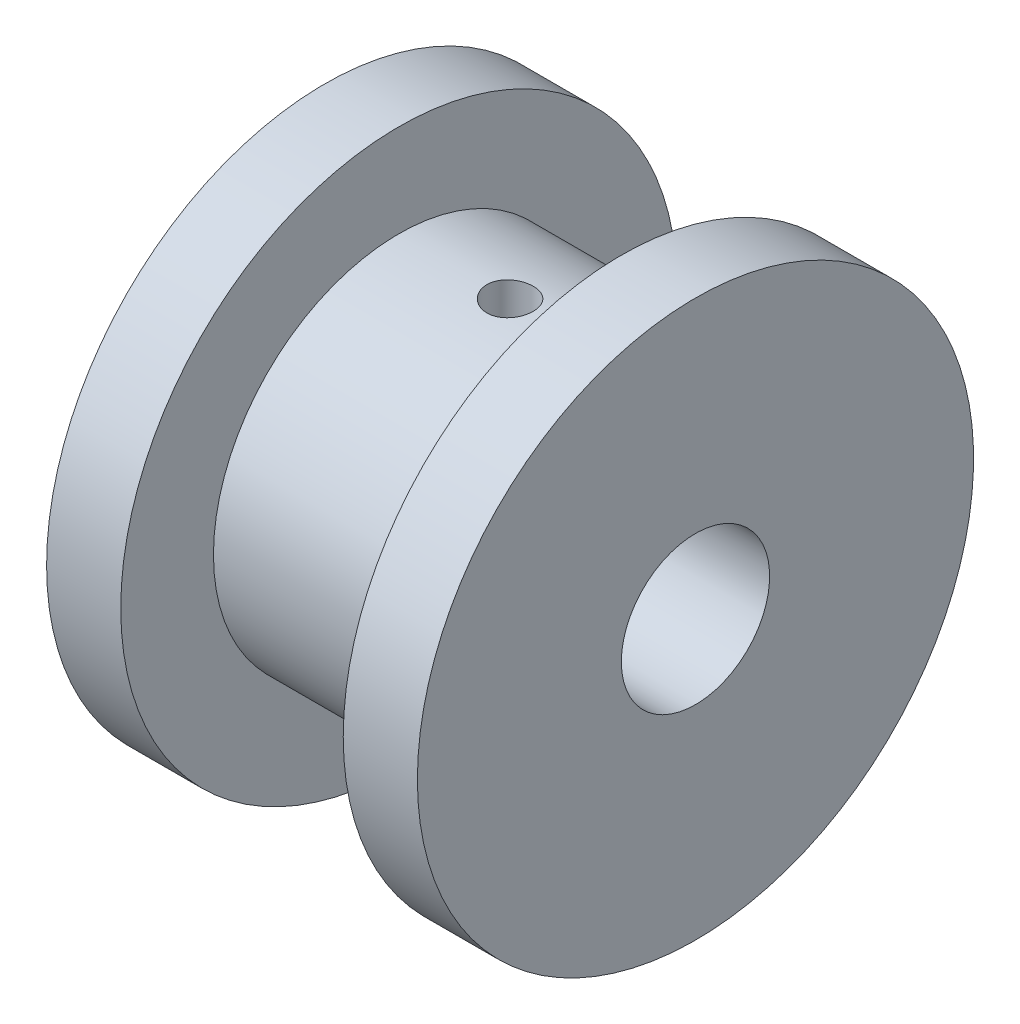
ISO-10303-21;
HEADER;
FILE_DESCRIPTION(('STEP AP214'),'2;1');
FILE_NAME('part.step','',(''),(''),'','','');
FILE_SCHEMA(('AUTOMOTIVE_DESIGN { 1 0 10303 214 1 1 1 1 }'));
ENDSEC;
DATA;
#1=APPLICATION_CONTEXT('core data for automotive mechanical design processes');
#2=APPLICATION_PROTOCOL_DEFINITION('international standard','automotive_design',2000,#1);
#3=PRODUCT_CONTEXT('',#1,'mechanical');
#4=PRODUCT('Part','Part','',(#3));
#5=PRODUCT_RELATED_PRODUCT_CATEGORY('part','',(#4));
#6=PRODUCT_DEFINITION_FORMATION('','',#4);
#7=PRODUCT_DEFINITION_CONTEXT('part definition',#1,'design');
#8=PRODUCT_DEFINITION('design','',#6,#7);
#9=PRODUCT_DEFINITION_SHAPE('','',#8);
#10=(LENGTH_UNIT() NAMED_UNIT(*) SI_UNIT(.MILLI.,.METRE.));
#11=(NAMED_UNIT(*) PLANE_ANGLE_UNIT() SI_UNIT($,.RADIAN.));
#12=(NAMED_UNIT(*) SI_UNIT($,.STERADIAN.) SOLID_ANGLE_UNIT());
#13=UNCERTAINTY_MEASURE_WITH_UNIT(LENGTH_MEASURE(1.E-05),#10,'distance_accuracy_value','');
#14=(GEOMETRIC_REPRESENTATION_CONTEXT(3) GLOBAL_UNCERTAINTY_ASSIGNED_CONTEXT((#13)) GLOBAL_UNIT_ASSIGNED_CONTEXT((#10,
#11,#12)) REPRESENTATION_CONTEXT('',''));
#15=CARTESIAN_POINT('',(0.,0.,0.));
#16=DIRECTION('',(0.,0.,1.));
#17=DIRECTION('',(1.,0.,0.));
#18=AXIS2_PLACEMENT_3D('',#15,#16,#17);
#19=CARTESIAN_POINT('',(0.,0.,-4.));
#20=DIRECTION('',(1.,0.,0.));
#21=DIRECTION('',(0.,0.,-1.));
#22=AXIS2_PLACEMENT_3D('',#19,#20,#21);
#23=PLANE('',#22);
#24=CARTESIAN_POINT('',(0.,0.,0.));
#25=DIRECTION('',(-1.,0.,0.));
#26=DIRECTION('',(0.,0.,1.));
#27=AXIS2_PLACEMENT_3D('',#24,#25,#26);
#28=CIRCLE('',#27,4.);
#29=CARTESIAN_POINT('',(0.,0.,4.));
#30=VERTEX_POINT('',#29);
#31=EDGE_CURVE('E76',#30,#30,#28,.T.);
#32=ORIENTED_EDGE('',*,*,#31,.F.);
#33=EDGE_LOOP('',(#32));
#34=FACE_BOUND('',#33,.T.);
#35=CARTESIAN_POINT('',(0.,0.,0.));
#36=DIRECTION('',(-1.,0.,0.));
#37=DIRECTION('',(0.,0.,1.));
#38=AXIS2_PLACEMENT_3D('',#35,#36,#37);
#39=CIRCLE('',#38,15.);
#40=CARTESIAN_POINT('',(0.,0.,15.));
#41=VERTEX_POINT('',#40);
#42=EDGE_CURVE('E10',#41,#41,#39,.T.);
#43=ORIENTED_EDGE('',*,*,#42,.T.);
#44=EDGE_LOOP('',(#43));
#45=FACE_BOUND('',#44,.T.);
#46=ADVANCED_FACE('F41',(#34,#45),#23,.F.);
#47=CARTESIAN_POINT('',(0.,0.,0.));
#48=DIRECTION('',(-1.,0.,0.));
#49=DIRECTION('',(0.,0.,1.));
#50=AXIS2_PLACEMENT_3D('',#47,#48,#49);
#51=CYLINDRICAL_SURFACE('',#50,15.);
#52=ORIENTED_EDGE('',*,*,#42,.F.);
#53=EDGE_LOOP('',(#52));
#54=FACE_BOUND('',#53,.T.);
#55=CARTESIAN_POINT('',(4.,0.,0.));
#56=DIRECTION('',(-1.,0.,0.));
#57=DIRECTION('',(0.,0.,1.));
#58=AXIS2_PLACEMENT_3D('',#55,#56,#57);
#59=CIRCLE('',#58,15.);
#60=CARTESIAN_POINT('',(4.,0.,15.));
#61=VERTEX_POINT('',#60);
#62=EDGE_CURVE('E48',#61,#61,#59,.T.);
#63=ORIENTED_EDGE('',*,*,#62,.T.);
#64=EDGE_LOOP('',(#63));
#65=FACE_BOUND('',#64,.T.);
#66=ADVANCED_FACE('F127',(#54,#65),#51,.T.);
#67=CARTESIAN_POINT('',(4.,0.,-15.));
#68=DIRECTION('',(-1.,0.,0.));
#69=DIRECTION('',(0.,0.,1.));
#70=AXIS2_PLACEMENT_3D('',#67,#68,#69);
#71=PLANE('',#70);
#72=ORIENTED_EDGE('',*,*,#62,.F.);
#73=EDGE_LOOP('',(#72));
#74=FACE_BOUND('',#73,.T.);
#75=CARTESIAN_POINT('',(4.,0.,0.));
#76=DIRECTION('',(-1.,0.,0.));
#77=DIRECTION('',(0.,0.,1.));
#78=AXIS2_PLACEMENT_3D('',#75,#76,#77);
#79=CIRCLE('',#78,10.);
#80=CARTESIAN_POINT('',(4.,0.,10.));
#81=VERTEX_POINT('',#80);
#82=EDGE_CURVE('E53',#81,#81,#79,.T.);
#83=ORIENTED_EDGE('',*,*,#82,.T.);
#84=EDGE_LOOP('',(#83));
#85=FACE_BOUND('',#84,.T.);
#86=ADVANCED_FACE('F122',(#74,#85),#71,.F.);
#87=CARTESIAN_POINT('',(0.,0.,0.));
#88=DIRECTION('',(-1.,0.,0.));
#89=DIRECTION('',(0.,0.,1.));
#90=AXIS2_PLACEMENT_3D('',#87,#88,#89);
#91=CYLINDRICAL_SURFACE('',#90,10.);
#92=CARTESIAN_POINT('',(10.,9.92156741649221,1.25));
#93=CARTESIAN_POINT('',(9.93008185810409,9.92156842085664,1.24999702741697));
#94=CARTESIAN_POINT('',(9.86012001754759,9.92231447559473,1.24411394951064));
#95=CARTESIAN_POINT('',(9.7221433872977,9.92521695489986,1.22073820686067));
#96=CARTESIAN_POINT('',(9.65413070975148,9.92737485321481,1.20323341054564));
#97=CARTESIAN_POINT('',(9.52207005894198,9.93285286887714,1.15713834641298));
#98=CARTESIAN_POINT('',(9.45801942894067,9.93617219726825,1.12855560239912));
#99=CARTESIAN_POINT('',(9.33563577408846,9.94359811759954,1.06113209921476));
#100=CARTESIAN_POINT('',(9.27730177412847,9.94770457492142,1.02229309368739));
#101=CARTESIAN_POINT('',(9.16766887643894,9.9562677962195,0.935226725132208));
#102=CARTESIAN_POINT('',(9.11640659884056,9.96072620851022,0.886953407512147));
#103=CARTESIAN_POINT('',(9.02268861553046,9.96947616437916,0.782487630335613));
#104=CARTESIAN_POINT('',(8.98023334795266,9.97376769964692,0.726294777029015));
#105=CARTESIAN_POINT('',(8.90520321024682,9.98171722306411,0.607354915337985));
#106=CARTESIAN_POINT('',(8.87266147745017,9.98537306923403,0.544586847780556));
#107=CARTESIAN_POINT('',(8.81859440002952,9.99162118477263,0.414423359027958));
#108=CARTESIAN_POINT('',(8.79706864653674,9.99421349361484,0.347028109680452));
#109=CARTESIAN_POINT('',(8.76575396583279,9.99803084353114,0.209897843875555));
#110=CARTESIAN_POINT('',(8.75590416073806,9.9992629741797,0.140176929831688));
#111=CARTESIAN_POINT('',(8.74803230748173,10.0002453486461,6.16003432728679E-05));
#112=CARTESIAN_POINT('',(8.75000979402373,9.99999565076039,-0.0703327884973859));
#113=CARTESIAN_POINT('',(8.76568760137872,9.99804823885005,-0.209382634487274));
#114=CARTESIAN_POINT('',(8.77932244924069,9.99635861227864,-0.278045602882226));
#115=CARTESIAN_POINT('',(8.81782558831497,9.99173027971167,-0.412101081952687));
#116=CARTESIAN_POINT('',(8.84269409308342,9.98879154997023,-0.477493530428102));
#117=CARTESIAN_POINT('',(8.90302824639189,9.98198128903956,-0.603354407719319));
#118=CARTESIAN_POINT('',(8.93852222886509,9.97810726921619,-0.663809113920258));
#119=CARTESIAN_POINT('',(9.01907918110802,9.96985984532641,-0.777928726153237));
#120=CARTESIAN_POINT('',(9.06414258973429,9.96548641836132,-0.831593320608677));
#121=CARTESIAN_POINT('',(9.16292590929919,9.95669433761757,-0.930994015386471));
#122=CARTESIAN_POINT('',(9.21670287977333,9.95227557902364,-0.976673419997996));
#123=CARTESIAN_POINT('',(9.33119077839123,9.9439203597029,-1.05836642531255));
#124=CARTESIAN_POINT('',(9.39190172826903,9.9399839004879,-1.09437999571755));
#125=CARTESIAN_POINT('',(9.51858474778116,9.93303901306359,-1.15572228679137));
#126=CARTESIAN_POINT('',(9.5845590399766,9.93003097954065,-1.18104646493116));
#127=CARTESIAN_POINT('',(9.71986972676342,9.92529121247978,-1.22024082723404));
#128=CARTESIAN_POINT('',(9.78920595915436,9.92355941743351,-1.23411156339981));
#129=CARTESIAN_POINT('',(9.92877159099988,9.92157944392025,-1.2499302159543));
#130=CARTESIAN_POINT('',(9.9989918115444,9.92132133721188,-1.25195792099914));
#131=CARTESIAN_POINT('',(10.1387709648327,9.92229170559824,-1.24424347661528));
#132=CARTESIAN_POINT('',(10.2083299116397,9.92352014900725,-1.2345015780549));
#133=CARTESIAN_POINT('',(10.3445728817889,9.92731614241993,-1.20359164289886));
#134=CARTESIAN_POINT('',(10.4112658075952,9.9298791634733,-1.18246224187303));
#135=CARTESIAN_POINT('',(10.5401620774266,9.93605184985404,-1.12941685955806));
#136=CARTESIAN_POINT('',(10.6023652636204,9.93966155195382,-1.09750049929061));
#137=CARTESIAN_POINT('',(10.7208773219065,9.94754465676617,-1.02359101107746));
#138=CARTESIAN_POINT('',(10.7771533326572,9.95182146368541,-0.981545559788552));
#139=CARTESIAN_POINT('',(10.8818782769675,9.96054619775512,-0.888645371184477));
#140=CARTESIAN_POINT('',(10.930326905934,9.96499413155644,-0.837790291212741));
#141=CARTESIAN_POINT('',(11.0183020936672,9.9735904434348,-0.72836588777926));
#142=CARTESIAN_POINT('',(11.0577762233975,9.97773696956261,-0.669754246058515));
#143=CARTESIAN_POINT('',(11.1263191088169,9.98523556515805,-0.546686290840893));
#144=CARTESIAN_POINT('',(11.1553880742405,9.98858765063858,-0.48223009518416));
#145=CARTESIAN_POINT('',(11.202208893454,9.99411145326594,-0.349476929569726));
#146=CARTESIAN_POINT('',(11.2199910480158,9.99628632843852,-0.281190783255888));
#147=CARTESIAN_POINT('',(11.2438320446134,9.99922377338782,-0.142573028638979));
#148=CARTESIAN_POINT('',(11.2498914152996,9.99998640685089,-0.0722415127190527));
#149=CARTESIAN_POINT('',(11.2501049611461,10.0000131400683,0.0679585916718923));
#150=CARTESIAN_POINT('',(11.244339980284,9.9992874158392,0.137827068857367));
#151=CARTESIAN_POINT('',(11.2212396932846,9.99643920578969,0.275593870726307));
#152=CARTESIAN_POINT('',(11.2039043951941,9.99431672094073,0.343492196779924));
#153=CARTESIAN_POINT('',(11.1581809428252,9.98891242606017,0.475380721493657));
#154=CARTESIAN_POINT('',(11.1297966603134,9.98563102217235,0.539372280079785));
#155=CARTESIAN_POINT('',(11.0627893426962,9.9782722380314,0.66169666857201));
#156=CARTESIAN_POINT('',(11.0241661858692,9.97419484831559,0.720029431194013));
#157=CARTESIAN_POINT('',(10.9374783923318,9.96566596962789,0.829793383981277));
#158=CARTESIAN_POINT('',(10.8893536032382,9.9612122063946,0.881176893917149));
#159=CARTESIAN_POINT('',(10.7851535279856,9.95245079506771,0.975170559409672));
#160=CARTESIAN_POINT('',(10.7290763612545,9.94814318183499,1.01777863389674));
#161=CARTESIAN_POINT('',(10.6103150386513,9.94014405697344,1.09315262125802));
#162=CARTESIAN_POINT('',(10.5476062050325,9.93645498876141,1.12587989158337));
#163=CARTESIAN_POINT('',(10.4175716297026,9.93013929059811,1.18029264417167));
#164=CARTESIAN_POINT('',(10.3502510003483,9.92751150576939,1.20199013561415));
#165=CARTESIAN_POINT('',(10.2354850064782,9.92425393409921,1.22853294811899));
#166=CARTESIAN_POINT('',(10.1887635242312,9.92325150760955,1.23657151550529));
#167=CARTESIAN_POINT('',(10.0947013750165,9.92190791114956,1.24730602795275));
#168=CARTESIAN_POINT('',(10.0473607127495,9.92156673616213,1.25000201354966));
#169=CARTESIAN_POINT('',(10.,9.92156741649221,1.25));
#170=B_SPLINE_CURVE_WITH_KNOTS('',3,(#92,#93,#94,#95,#96,#97,#98,#99,#100,#101,#102,#103,#104,
#105,#106,#107,#108,#109,#110,#111,#112,#113,#114,#115,#116,#117,#118,#119,#120,#121,#122,#123,
#124,#125,#126,#127,#128,#129,#130,#131,#132,#133,#134,#135,#136,#137,#138,#139,#140,#141,#142,
#143,#144,#145,#146,#147,#148,#149,#150,#151,#152,#153,#154,#155,#156,#157,#158,#159,#160,#161,
#162,#163,#164,#165,#166,#167,#168,#169),.UNSPECIFIED.,.T.,.F.,(4,2,2,2,2,2,2,2,2,2,2,2,2,2,2,2,
2,2,2,2,2,2,2,2,2,2,2,2,2,2,2,2,2,2,2,2,2,2,4),(0.,0.20958140873962,0.41938193807619,
0.6290402262906,0.838662689753061,1.04933288774533,1.26001356371289,1.4713909307287,
1.68276045169915,1.89302298470728,2.10327724585054,2.31235832466519,2.52144337835894,
2.73109102206401,2.94074828234552,3.15183848688884,3.36292935309712,3.57410983369504,
3.78528013578093,3.99502608902941,4.20476757163557,4.41380188146366,4.62284353605926,
4.83298909772054,5.04314283497404,5.2544944294617,5.46584176354438,5.67661928392469,
5.88738729886405,6.09671908144126,6.30605071843393,6.51530906772044,6.72456990482123,
6.93520064445417,7.14588127719913,7.35737548852416,7.56863892991007,7.71060494816473,
7.85256988927735),.UNSPECIFIED.);
#171=CARTESIAN_POINT('',(10.,9.92156741649221,1.25));
#172=VERTEX_POINT('',#171);
#173=EDGE_CURVE('E80',#172,#172,#170,.T.);
#174=ORIENTED_EDGE('',*,*,#173,.T.);
#175=EDGE_LOOP('',(#174));
#176=FACE_BOUND('',#175,.T.);
#177=ORIENTED_EDGE('',*,*,#82,.F.);
#178=EDGE_LOOP('',(#177));
#179=FACE_BOUND('',#178,.T.);
#180=CARTESIAN_POINT('',(16.,0.,0.));
#181=DIRECTION('',(-1.,0.,0.));
#182=DIRECTION('',(0.,0.,1.));
#183=AXIS2_PLACEMENT_3D('',#180,#181,#182);
#184=CIRCLE('',#183,10.);
#185=CARTESIAN_POINT('',(16.,0.,10.));
#186=VERTEX_POINT('',#185);
#187=EDGE_CURVE('E58',#186,#186,#184,.T.);
#188=ORIENTED_EDGE('',*,*,#187,.T.);
#189=EDGE_LOOP('',(#188));
#190=FACE_BOUND('',#189,.T.);
#191=ADVANCED_FACE('F94',(#176,#179,#190),#91,.T.);
#192=CARTESIAN_POINT('',(16.,0.,-10.));
#193=DIRECTION('',(1.,0.,0.));
#194=DIRECTION('',(0.,0.,-1.));
#195=AXIS2_PLACEMENT_3D('',#192,#193,#194);
#196=PLANE('',#195);
#197=ORIENTED_EDGE('',*,*,#187,.F.);
#198=EDGE_LOOP('',(#197));
#199=FACE_BOUND('',#198,.T.);
#200=CARTESIAN_POINT('',(16.,0.,0.));
#201=DIRECTION('',(-1.,0.,0.));
#202=DIRECTION('',(0.,0.,1.));
#203=AXIS2_PLACEMENT_3D('',#200,#201,#202);
#204=CIRCLE('',#203,15.);
#205=CARTESIAN_POINT('',(16.,0.,15.));
#206=VERTEX_POINT('',#205);
#207=EDGE_CURVE('E64',#206,#206,#204,.T.);
#208=ORIENTED_EDGE('',*,*,#207,.T.);
#209=EDGE_LOOP('',(#208));
#210=FACE_BOUND('',#209,.T.);
#211=ADVANCED_FACE('F115',(#199,#210),#196,.F.);
#212=CARTESIAN_POINT('',(0.,0.,0.));
#213=DIRECTION('',(-1.,0.,0.));
#214=DIRECTION('',(0.,0.,1.));
#215=AXIS2_PLACEMENT_3D('',#212,#213,#214);
#216=CYLINDRICAL_SURFACE('',#215,15.);
#217=ORIENTED_EDGE('',*,*,#207,.F.);
#218=EDGE_LOOP('',(#217));
#219=FACE_BOUND('',#218,.T.);
#220=CARTESIAN_POINT('',(20.,0.,0.));
#221=DIRECTION('',(-1.,0.,0.));
#222=DIRECTION('',(0.,0.,1.));
#223=AXIS2_PLACEMENT_3D('',#220,#221,#222);
#224=CIRCLE('',#223,15.);
#225=CARTESIAN_POINT('',(20.,0.,15.));
#226=VERTEX_POINT('',#225);
#227=EDGE_CURVE('E68',#226,#226,#224,.T.);
#228=ORIENTED_EDGE('',*,*,#227,.T.);
#229=EDGE_LOOP('',(#228));
#230=FACE_BOUND('',#229,.T.);
#231=ADVANCED_FACE('F112',(#219,#230),#216,.T.);
#232=CARTESIAN_POINT('',(20.,0.,-4.));
#233=DIRECTION('',(-1.,0.,0.));
#234=DIRECTION('',(0.,0.,1.));
#235=AXIS2_PLACEMENT_3D('',#232,#233,#234);
#236=PLANE('',#235);
#237=ORIENTED_EDGE('',*,*,#227,.F.);
#238=EDGE_LOOP('',(#237));
#239=FACE_BOUND('',#238,.T.);
#240=CARTESIAN_POINT('',(20.,0.,0.));
#241=DIRECTION('',(-1.,0.,0.));
#242=DIRECTION('',(0.,0.,1.));
#243=AXIS2_PLACEMENT_3D('',#240,#241,#242);
#244=CIRCLE('',#243,4.);
#245=CARTESIAN_POINT('',(20.,0.,4.));
#246=VERTEX_POINT('',#245);
#247=EDGE_CURVE('E72',#246,#246,#244,.T.);
#248=ORIENTED_EDGE('',*,*,#247,.T.);
#249=EDGE_LOOP('',(#248));
#250=FACE_BOUND('',#249,.T.);
#251=ADVANCED_FACE('F108',(#239,#250),#236,.F.);
#252=CARTESIAN_POINT('',(0.,0.,0.));
#253=DIRECTION('',(-1.,0.,0.));
#254=DIRECTION('',(0.,0.,1.));
#255=AXIS2_PLACEMENT_3D('',#252,#253,#254);
#256=CYLINDRICAL_SURFACE('',#255,4.);
#257=CARTESIAN_POINT('',(10.,3.79967103839267,1.25));
#258=CARTESIAN_POINT('',(10.0683470361093,3.79967145961936,1.24999953780047));
#259=CARTESIAN_POINT('',(10.1366987687032,3.80153531505043,1.24437538791494));
#260=CARTESIAN_POINT('',(10.2713941608778,3.80875638998877,1.22209175401327));
#261=CARTESIAN_POINT('',(10.3377372727322,3.81411455353136,1.20542928782515));
#262=CARTESIAN_POINT('',(10.466444901932,3.8276593883596,1.16169788223559));
#263=CARTESIAN_POINT('',(10.5288162331057,3.83584105194317,1.13464735736677));
#264=CARTESIAN_POINT('',(10.648152695864,3.85410406218688,1.07096914173157));
#265=CARTESIAN_POINT('',(10.7051168699601,3.86418574435841,1.03433975905632));
#266=CARTESIAN_POINT('',(10.8139788674935,3.8855012766862,0.95119607062229));
#267=CARTESIAN_POINT('',(10.865663609436,3.8967612338478,0.904409399720395));
#268=CARTESIAN_POINT('',(10.9605960132092,3.91894245860336,0.802862046455491));
#269=CARTESIAN_POINT('',(11.0038424969448,3.92986367872627,0.748100252518562));
#270=CARTESIAN_POINT('',(11.0816110630112,3.95043553390078,0.630625912493359));
#271=CARTESIAN_POINT('',(11.1159137038315,3.9600518456278,0.567761556520092));
#272=CARTESIAN_POINT('',(11.1733760498555,3.97662551833019,0.436804232853401));
#273=CARTESIAN_POINT('',(11.1965383741496,3.98358350419919,0.36871249848705));
#274=CARTESIAN_POINT('',(11.2303511280971,3.99387175820863,0.231464356966097));
#275=CARTESIAN_POINT('',(11.2413657497878,3.99730738984143,0.162405715468214));
#276=CARTESIAN_POINT('',(11.2517243464375,4.00053595876015,0.0233408139845193));
#277=CARTESIAN_POINT('',(11.2510709743588,4.00032972410065,-0.0466652269730842));
#278=CARTESIAN_POINT('',(11.2383517084141,3.99637116132537,-0.183074480354735));
#279=CARTESIAN_POINT('',(11.226680616487,3.99274150972157,-0.249518634314045));
#280=CARTESIAN_POINT('',(11.192905009957,3.98249482560855,-0.379453063347771));
#281=CARTESIAN_POINT('',(11.1707998149134,3.97587759827134,-0.442943145481196));
#282=CARTESIAN_POINT('',(11.1165298109251,3.96023459729533,-0.566078103154781));
#283=CARTESIAN_POINT('',(11.084245191437,3.95118033616957,-0.62566640562283));
#284=CARTESIAN_POINT('',(11.0106289002954,3.93161722953562,-0.738702511152028));
#285=CARTESIAN_POINT('',(10.9692949408622,3.92110801644584,-0.792148756208837));
#286=CARTESIAN_POINT('',(10.8767263651987,3.89923670734646,-0.89373769845388));
#287=CARTESIAN_POINT('',(10.8251509311588,3.88785731989084,-0.941566549094177));
#288=CARTESIAN_POINT('',(10.7146048981755,3.86590615440412,-1.02798974259538));
#289=CARTESIAN_POINT('',(10.655633429425,3.85533447159847,-1.06658299775341));
#290=CARTESIAN_POINT('',(10.5310825311402,3.83610846648974,-1.13380465019765));
#291=CARTESIAN_POINT('',(10.4654365909576,3.82747690354324,-1.16231680702682));
#292=CARTESIAN_POINT('',(10.3299405081047,3.81337545338913,-1.20778345948513));
#293=CARTESIAN_POINT('',(10.2600918857895,3.80790443033294,-1.22474210765793));
#294=CARTESIAN_POINT('',(10.1211800474342,3.80099563391872,-1.24601485185708));
#295=CARTESIAN_POINT('',(10.0521980037679,3.79940466389696,-1.25080954353711));
#296=CARTESIAN_POINT('',(9.91441025850184,3.80001077463985,-1.24896744498307));
#297=CARTESIAN_POINT('',(9.84560453129954,3.80220727008389,-1.24233242111456));
#298=CARTESIAN_POINT('',(9.71219170334836,3.80998957482874,-1.21824873513143));
#299=CARTESIAN_POINT('',(9.64752072592601,3.81547554101732,-1.20111831160537));
#300=CARTESIAN_POINT('',(9.52197820800396,3.82911287331661,-1.15690373661027));
#301=CARTESIAN_POINT('',(9.46110728907881,3.83726467412388,-1.12981796171154));
#302=CARTESIAN_POINT('',(9.34296089022825,3.85560539653156,-1.06557510655874));
#303=CARTESIAN_POINT('',(9.28583858440722,3.86584603489733,-1.02815147488557));
#304=CARTESIAN_POINT('',(9.17850965363808,3.88710348972829,-0.944606408679808));
#305=CARTESIAN_POINT('',(9.12830483107467,3.89812050735703,-0.898482714690781));
#306=CARTESIAN_POINT('',(9.03408963408719,3.92024187562679,-0.796572947753602));
#307=CARTESIAN_POINT('',(8.99042221386014,3.9313309228568,-0.740465649788518));
#308=CARTESIAN_POINT('',(8.91310895667874,3.95189059843678,-0.621451545651395));
#309=CARTESIAN_POINT('',(8.87946266068896,3.96136130090946,-0.558545051108621));
#310=CARTESIAN_POINT('',(8.82346943752832,3.97756311928512,-0.42810552333183));
#311=CARTESIAN_POINT('',(8.80104071215632,3.984313995612,-0.360610184283755));
#312=CARTESIAN_POINT('',(8.7679274614103,3.99440242648576,-0.222557254056389));
#313=CARTESIAN_POINT('',(8.75723926091651,3.99774104914277,-0.152000628340356));
#314=CARTESIAN_POINT('',(8.74820899825038,4.00055803404462,-0.0129849366488983));
#315=CARTESIAN_POINT('',(8.74937154982924,4.0001912940739,0.0554391919465225));
#316=CARTESIAN_POINT('',(8.7628118110487,3.99600978081049,0.191073221923248));
#317=CARTESIAN_POINT('',(8.77508879599195,3.99219523232619,0.258283202179568));
#318=CARTESIAN_POINT('',(8.81009400922228,3.98159570844796,0.388755118480791));
#319=CARTESIAN_POINT('',(8.83268960784537,3.97484847960205,0.45205591844948));
#320=CARTESIAN_POINT('',(8.88757082720848,3.9590794558795,0.57399842550009));
#321=CARTESIAN_POINT('',(8.91985810997343,3.95005727091358,0.632639331274481));
#322=CARTESIAN_POINT('',(8.99447275834444,3.93029896883376,0.745761694969688));
#323=CARTESIAN_POINT('',(9.03710352246397,3.91951509750962,0.800034607053111));
#324=CARTESIAN_POINT('',(9.13065988944347,3.89758736547061,0.900820791399319));
#325=CARTESIAN_POINT('',(9.18158797413939,3.88644339784826,0.947331733504159));
#326=CARTESIAN_POINT('',(9.2923157198411,3.86461892577438,1.03282865911252));
#327=CARTESIAN_POINT('',(9.35235340311658,3.85396600863456,1.07151427994711));
#328=CARTESIAN_POINT('',(9.47839812026914,3.83480125279531,1.13820470748521));
#329=CARTESIAN_POINT('',(9.54440272645025,3.82628854861387,1.16621383403546));
#330=CARTESIAN_POINT('',(9.67472261731467,3.81306560440328,1.20871180435792));
#331=CARTESIAN_POINT('',(9.73870254745156,3.80809315043749,1.22414939837873));
#332=CARTESIAN_POINT('',(9.86845383209649,3.80139606482399,1.24479245816099));
#333=CARTESIAN_POINT('',(9.9342247412015,3.79967063301598,1.25000044480778));
#334=CARTESIAN_POINT('',(10.,3.79967103839267,1.25));
#335=B_SPLINE_CURVE_WITH_KNOTS('',3,(#257,#258,#259,#260,#261,#262,#263,#264,#265,#266,#267,
#268,#269,#270,#271,#272,#273,#274,#275,#276,#277,#278,#279,#280,#281,#282,#283,#284,#285,#286,
#287,#288,#289,#290,#291,#292,#293,#294,#295,#296,#297,#298,#299,#300,#301,#302,#303,#304,#305,
#306,#307,#308,#309,#310,#311,#312,#313,#314,#315,#316,#317,#318,#319,#320,#321,#322,#323,#324,
#325,#326,#327,#328,#329,#330,#331,#332,#333,#334),.UNSPECIFIED.,.T.,.F.,(4,2,2,2,2,2,2,2,2,2,2,
2,2,2,2,2,2,2,2,2,2,2,2,2,2,2,2,2,2,2,2,2,2,2,2,2,2,2,4),(0.,0.204798137548489,
0.409651627059736,0.614143644118581,0.818671804924948,1.02957080550838,1.24049922941123,
1.45619821963733,1.67184647417922,1.88083722835533,2.08978046471774,2.2915098296975,
2.49325235190093,2.69746404608409,2.90172742713187,3.11450338937334,3.32730439853776,
3.54248470934454,3.75758763952752,3.96404933287935,4.17047912219089,4.37093972044362,
4.57143302253209,4.7776761330961,4.9839728801188,5.19881937811511,5.41365603317086,
5.62690239290997,5.84008198140584,6.04438802439524,6.24868074692306,6.45041846514758,
6.65219079911651,6.86080693105214,7.0694855777219,7.28507795501704,7.50058300803821,
7.69772354371385,7.89481549188778),.UNSPECIFIED.);
#336=CARTESIAN_POINT('',(10.,3.79967103839267,1.25));
#337=VERTEX_POINT('',#336);
#338=EDGE_CURVE('E89',#337,#337,#335,.T.);
#339=ORIENTED_EDGE('',*,*,#338,.T.);
#340=EDGE_LOOP('',(#339));
#341=FACE_BOUND('',#340,.T.);
#342=ORIENTED_EDGE('',*,*,#247,.F.);
#343=EDGE_LOOP('',(#342));
#344=FACE_BOUND('',#343,.T.);
#345=ORIENTED_EDGE('',*,*,#31,.T.);
#346=EDGE_LOOP('',(#345));
#347=FACE_BOUND('',#346,.T.);
#348=ADVANCED_FACE('F101',(#341,#344,#347),#256,.F.);
#349=CARTESIAN_POINT('',(10.,10.,0.));
#350=DIRECTION('',(0.,1.,0.));
#351=DIRECTION('',(0.,0.,1.));
#352=AXIS2_PLACEMENT_3D('',#349,#350,#351);
#353=CYLINDRICAL_SURFACE('',#352,1.25);
#354=ORIENTED_EDGE('',*,*,#338,.F.);
#355=EDGE_LOOP('',(#354));
#356=FACE_BOUND('',#355,.T.);
#357=ORIENTED_EDGE('',*,*,#173,.F.);
#358=EDGE_LOOP('',(#357));
#359=FACE_BOUND('',#358,.T.);
#360=ADVANCED_FACE('F98',(#356,#359),#353,.F.);
#361=CLOSED_SHELL('',(#46,#66,#86,#191,#211,#231,#251,#348,#360));
#362=MANIFOLD_SOLID_BREP('B2',#361);
#363=ADVANCED_BREP_SHAPE_REPRESENTATION('',(#18,#362),#14);
#364=SHAPE_DEFINITION_REPRESENTATION(#9,#363);
ENDSEC;
END-ISO-10303-21;
